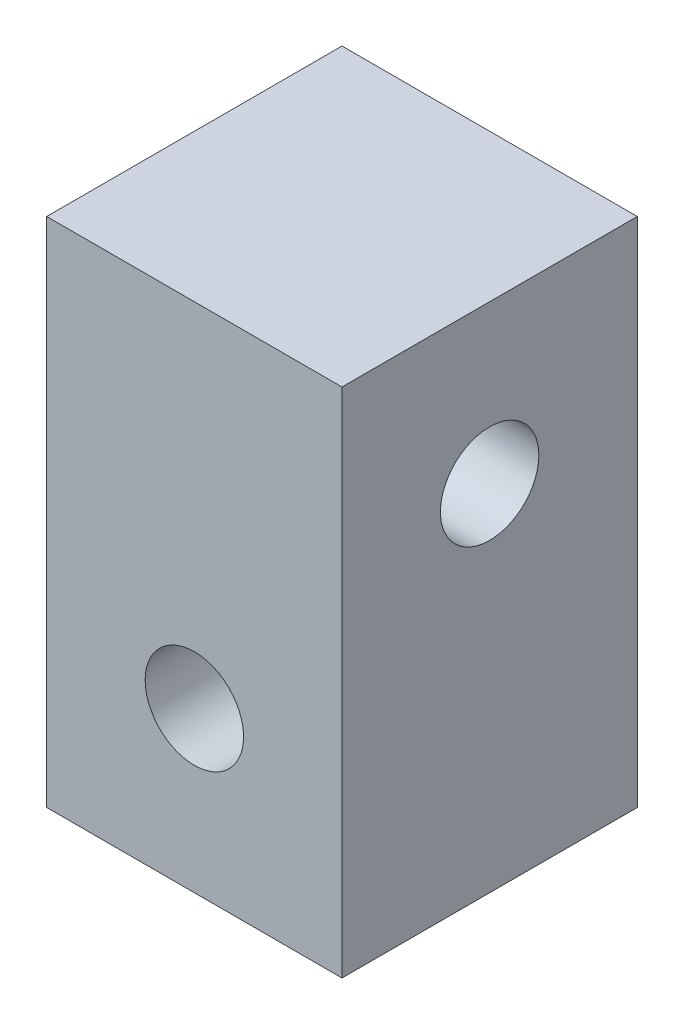
ISO-10303-21;
HEADER;
FILE_DESCRIPTION(('STEP AP214'),'2;1');
FILE_NAME('part.step','',(''),(''),'','','');
FILE_SCHEMA(('AUTOMOTIVE_DESIGN { 1 0 10303 214 1 1 1 1 }'));
ENDSEC;
DATA;
#1=APPLICATION_CONTEXT('core data for automotive mechanical design processes');
#2=APPLICATION_PROTOCOL_DEFINITION('international standard','automotive_design',2000,#1);
#3=PRODUCT_CONTEXT('',#1,'mechanical');
#4=PRODUCT('Part','Part','',(#3));
#5=PRODUCT_RELATED_PRODUCT_CATEGORY('part','',(#4));
#6=PRODUCT_DEFINITION_FORMATION('','',#4);
#7=PRODUCT_DEFINITION_CONTEXT('part definition',#1,'design');
#8=PRODUCT_DEFINITION('design','',#6,#7);
#9=PRODUCT_DEFINITION_SHAPE('','',#8);
#10=(LENGTH_UNIT() NAMED_UNIT(*) SI_UNIT(.MILLI.,.METRE.));
#11=(NAMED_UNIT(*) PLANE_ANGLE_UNIT() SI_UNIT($,.RADIAN.));
#12=(NAMED_UNIT(*) SI_UNIT($,.STERADIAN.) SOLID_ANGLE_UNIT());
#13=UNCERTAINTY_MEASURE_WITH_UNIT(LENGTH_MEASURE(1.E-05),#10,'distance_accuracy_value','');
#14=(GEOMETRIC_REPRESENTATION_CONTEXT(3) GLOBAL_UNCERTAINTY_ASSIGNED_CONTEXT((#13)) GLOBAL_UNIT_ASSIGNED_CONTEXT((#10,
#11,#12)) REPRESENTATION_CONTEXT('',''));
#15=CARTESIAN_POINT('',(0.,0.,0.));
#16=DIRECTION('',(0.,0.,1.));
#17=DIRECTION('',(1.,0.,0.));
#18=AXIS2_PLACEMENT_3D('',#15,#16,#17);
#19=CARTESIAN_POINT('',(3.75,13.,3.75));
#20=DIRECTION('',(-1.,0.,0.));
#21=DIRECTION('',(0.,0.,1.));
#22=AXIS2_PLACEMENT_3D('',#19,#20,#21);
#23=PLANE('',#22);
#24=CARTESIAN_POINT('',(3.75,9.,0.));
#25=DIRECTION('',(1.,0.,0.));
#26=DIRECTION('',(0.,0.,-1.));
#27=AXIS2_PLACEMENT_3D('',#24,#25,#26);
#28=CIRCLE('',#27,1.25);
#29=CARTESIAN_POINT('',(3.75,9.,-1.25));
#30=VERTEX_POINT('',#29);
#31=EDGE_CURVE('E142',#30,#30,#28,.T.);
#32=ORIENTED_EDGE('',*,*,#31,.F.);
#33=EDGE_LOOP('',(#32));
#34=FACE_BOUND('',#33,.T.);
#35=DIRECTION('',(0.,0.,-1.));
#36=VECTOR('',#35,1.);
#37=CARTESIAN_POINT('',(3.75,0.,3.75));
#38=LINE('',#37,#36);
#39=CARTESIAN_POINT('',(3.75,0.,3.75));
#40=VERTEX_POINT('',#39);
#41=CARTESIAN_POINT('',(3.75,0.,-3.75));
#42=VERTEX_POINT('',#41);
#43=EDGE_CURVE('E116',#40,#42,#38,.T.);
#44=ORIENTED_EDGE('',*,*,#43,.T.);
#45=DIRECTION('',(0.,-1.,0.));
#46=VECTOR('',#45,1.);
#47=CARTESIAN_POINT('',(3.75,13.,-3.75));
#48=LINE('',#47,#46);
#49=CARTESIAN_POINT('',(3.75,13.,-3.75));
#50=VERTEX_POINT('',#49);
#51=EDGE_CURVE('E11',#50,#42,#48,.T.);
#52=ORIENTED_EDGE('',*,*,#51,.F.);
#53=DIRECTION('',(0.,0.,-1.));
#54=VECTOR('',#53,1.);
#55=CARTESIAN_POINT('',(3.75,13.,3.75));
#56=LINE('',#55,#54);
#57=CARTESIAN_POINT('',(3.75,13.,3.75));
#58=VERTEX_POINT('',#57);
#59=EDGE_CURVE('E99',#58,#50,#56,.T.);
#60=ORIENTED_EDGE('',*,*,#59,.F.);
#61=DIRECTION('',(0.,-1.,0.));
#62=VECTOR('',#61,1.);
#63=CARTESIAN_POINT('',(3.75,13.,3.75));
#64=LINE('',#63,#62);
#65=EDGE_CURVE('E112',#58,#40,#64,.T.);
#66=ORIENTED_EDGE('',*,*,#65,.T.);
#67=EDGE_LOOP('',(#44,#52,#60,#66));
#68=FACE_BOUND('',#67,.T.);
#69=ADVANCED_FACE('F45',(#34,#68),#23,.F.);
#70=CARTESIAN_POINT('',(-3.75,13.,-3.75));
#71=DIRECTION('',(0.,0.,1.));
#72=DIRECTION('',(1.,0.,0.));
#73=AXIS2_PLACEMENT_3D('',#70,#71,#72);
#74=PLANE('',#73);
#75=CARTESIAN_POINT('',(0.,4.05305883438852,-3.75));
#76=DIRECTION('',(0.,0.,-1.));
#77=DIRECTION('',(-1.,0.,0.));
#78=AXIS2_PLACEMENT_3D('',#75,#76,#77);
#79=CIRCLE('',#78,1.25);
#80=CARTESIAN_POINT('',(-1.25,4.05305883438852,-3.75));
#81=VERTEX_POINT('',#80);
#82=EDGE_CURVE('E132',#81,#81,#79,.T.);
#83=ORIENTED_EDGE('',*,*,#82,.F.);
#84=EDGE_LOOP('',(#83));
#85=FACE_BOUND('',#84,.T.);
#86=DIRECTION('',(-1.,0.,0.));
#87=VECTOR('',#86,1.);
#88=CARTESIAN_POINT('',(-3.75,0.,-3.75));
#89=LINE('',#88,#87);
#90=CARTESIAN_POINT('',(-3.75,0.,-3.75));
#91=VERTEX_POINT('',#90);
#92=EDGE_CURVE('E104',#42,#91,#89,.T.);
#93=ORIENTED_EDGE('',*,*,#92,.T.);
#94=DIRECTION('',(0.,-1.,0.));
#95=VECTOR('',#94,1.);
#96=CARTESIAN_POINT('',(-3.75,13.,-3.75));
#97=LINE('',#96,#95);
#98=CARTESIAN_POINT('',(-3.75,13.,-3.75));
#99=VERTEX_POINT('',#98);
#100=EDGE_CURVE('E55',#99,#91,#97,.T.);
#101=ORIENTED_EDGE('',*,*,#100,.F.);
#102=DIRECTION('',(-1.,0.,0.));
#103=VECTOR('',#102,1.);
#104=CARTESIAN_POINT('',(-3.75,13.,-3.75));
#105=LINE('',#104,#103);
#106=EDGE_CURVE('E94',#50,#99,#105,.T.);
#107=ORIENTED_EDGE('',*,*,#106,.F.);
#108=ORIENTED_EDGE('',*,*,#51,.T.);
#109=EDGE_LOOP('',(#93,#101,#107,#108));
#110=FACE_BOUND('',#109,.T.);
#111=ADVANCED_FACE('F103',(#85,#110),#74,.F.);
#112=CARTESIAN_POINT('',(-3.75,13.,3.75));
#113=DIRECTION('',(1.,0.,0.));
#114=DIRECTION('',(0.,0.,-1.));
#115=AXIS2_PLACEMENT_3D('',#112,#113,#114);
#116=PLANE('',#115);
#117=CARTESIAN_POINT('',(-3.75,9.,0.));
#118=DIRECTION('',(1.,0.,0.));
#119=DIRECTION('',(0.,0.,-1.));
#120=AXIS2_PLACEMENT_3D('',#117,#118,#119);
#121=CIRCLE('',#120,1.25);
#122=CARTESIAN_POINT('',(-3.75,9.,-1.25));
#123=VERTEX_POINT('',#122);
#124=EDGE_CURVE('E48',#123,#123,#121,.T.);
#125=ORIENTED_EDGE('',*,*,#124,.T.);
#126=EDGE_LOOP('',(#125));
#127=FACE_BOUND('',#126,.T.);
#128=DIRECTION('',(0.,0.,1.));
#129=VECTOR('',#128,1.);
#130=CARTESIAN_POINT('',(-3.75,0.,3.75));
#131=LINE('',#130,#129);
#132=CARTESIAN_POINT('',(-3.75,0.,3.75));
#133=VERTEX_POINT('',#132);
#134=EDGE_CURVE('E81',#91,#133,#131,.T.);
#135=ORIENTED_EDGE('',*,*,#134,.T.);
#136=DIRECTION('',(0.,-1.,0.));
#137=VECTOR('',#136,1.);
#138=CARTESIAN_POINT('',(-3.75,13.,3.75));
#139=LINE('',#138,#137);
#140=CARTESIAN_POINT('',(-3.75,13.,3.75));
#141=VERTEX_POINT('',#140);
#142=EDGE_CURVE('E106',#141,#133,#139,.T.);
#143=ORIENTED_EDGE('',*,*,#142,.F.);
#144=DIRECTION('',(0.,0.,1.));
#145=VECTOR('',#144,1.);
#146=CARTESIAN_POINT('',(-3.75,13.,3.75));
#147=LINE('',#146,#145);
#148=EDGE_CURVE('E97',#99,#141,#147,.T.);
#149=ORIENTED_EDGE('',*,*,#148,.F.);
#150=ORIENTED_EDGE('',*,*,#100,.T.);
#151=EDGE_LOOP('',(#135,#143,#149,#150));
#152=FACE_BOUND('',#151,.T.);
#153=ADVANCED_FACE('F108',(#127,#152),#116,.F.);
#154=CARTESIAN_POINT('',(-3.75,13.,3.75));
#155=DIRECTION('',(0.,0.,-1.));
#156=DIRECTION('',(-1.,0.,0.));
#157=AXIS2_PLACEMENT_3D('',#154,#155,#156);
#158=PLANE('',#157);
#159=CARTESIAN_POINT('',(0.,4.05305883438852,3.75));
#160=DIRECTION('',(0.,0.,-1.));
#161=DIRECTION('',(-1.,0.,0.));
#162=AXIS2_PLACEMENT_3D('',#159,#160,#161);
#163=CIRCLE('',#162,1.25);
#164=CARTESIAN_POINT('',(-1.25,4.05305883438852,3.75));
#165=VERTEX_POINT('',#164);
#166=EDGE_CURVE('E120',#165,#165,#163,.T.);
#167=ORIENTED_EDGE('',*,*,#166,.T.);
#168=EDGE_LOOP('',(#167));
#169=FACE_BOUND('',#168,.T.);
#170=DIRECTION('',(1.,0.,0.));
#171=VECTOR('',#170,1.);
#172=CARTESIAN_POINT('',(-3.75,0.,3.75));
#173=LINE('',#172,#171);
#174=EDGE_CURVE('E87',#133,#40,#173,.T.);
#175=ORIENTED_EDGE('',*,*,#174,.T.);
#176=ORIENTED_EDGE('',*,*,#65,.F.);
#177=DIRECTION('',(1.,0.,0.));
#178=VECTOR('',#177,1.);
#179=CARTESIAN_POINT('',(-3.75,13.,3.75));
#180=LINE('',#179,#178);
#181=EDGE_CURVE('E64',#141,#58,#180,.T.);
#182=ORIENTED_EDGE('',*,*,#181,.F.);
#183=ORIENTED_EDGE('',*,*,#142,.T.);
#184=EDGE_LOOP('',(#175,#176,#182,#183));
#185=FACE_BOUND('',#184,.T.);
#186=ADVANCED_FACE('F166',(#169,#185),#158,.F.);
#187=CARTESIAN_POINT('',(0.,13.,0.));
#188=DIRECTION('',(0.,-1.,0.));
#189=DIRECTION('',(0.,0.,-1.));
#190=AXIS2_PLACEMENT_3D('',#187,#188,#189);
#191=PLANE('',#190);
#192=ORIENTED_EDGE('',*,*,#59,.T.);
#193=ORIENTED_EDGE('',*,*,#106,.T.);
#194=ORIENTED_EDGE('',*,*,#148,.T.);
#195=ORIENTED_EDGE('',*,*,#181,.T.);
#196=EDGE_LOOP('',(#192,#193,#194,#195));
#197=FACE_BOUND('',#196,.T.);
#198=ADVANCED_FACE('F95',(#197),#191,.F.);
#199=CARTESIAN_POINT('',(0.,0.,0.));
#200=DIRECTION('',(0.,-1.,0.));
#201=DIRECTION('',(0.,0.,-1.));
#202=AXIS2_PLACEMENT_3D('',#199,#200,#201);
#203=PLANE('',#202);
#204=ORIENTED_EDGE('',*,*,#43,.F.);
#205=ORIENTED_EDGE('',*,*,#174,.F.);
#206=ORIENTED_EDGE('',*,*,#134,.F.);
#207=ORIENTED_EDGE('',*,*,#92,.F.);
#208=EDGE_LOOP('',(#204,#205,#206,#207));
#209=FACE_BOUND('',#208,.T.);
#210=ADVANCED_FACE('F156',(#209),#203,.T.);
#211=CARTESIAN_POINT('',(0.,4.05305883438852,6.25));
#212=DIRECTION('',(0.,0.,-1.));
#213=DIRECTION('',(-1.,0.,0.));
#214=AXIS2_PLACEMENT_3D('',#211,#212,#213);
#215=CYLINDRICAL_SURFACE('',#214,1.25);
#216=ORIENTED_EDGE('',*,*,#82,.T.);
#217=EDGE_LOOP('',(#216));
#218=FACE_BOUND('',#217,.T.);
#219=ORIENTED_EDGE('',*,*,#166,.F.);
#220=EDGE_LOOP('',(#219));
#221=FACE_BOUND('',#220,.T.);
#222=ADVANCED_FACE('F158',(#218,#221),#215,.F.);
#223=CARTESIAN_POINT('',(-6.25,9.,0.));
#224=DIRECTION('',(1.,0.,0.));
#225=DIRECTION('',(0.,0.,-1.));
#226=AXIS2_PLACEMENT_3D('',#223,#224,#225);
#227=CYLINDRICAL_SURFACE('',#226,1.25);
#228=ORIENTED_EDGE('',*,*,#31,.T.);
#229=EDGE_LOOP('',(#228));
#230=FACE_BOUND('',#229,.T.);
#231=ORIENTED_EDGE('',*,*,#124,.F.);
#232=EDGE_LOOP('',(#231));
#233=FACE_BOUND('',#232,.T.);
#234=ADVANCED_FACE('F149',(#230,#233),#227,.F.);
#235=CLOSED_SHELL('',(#69,#111,#153,#186,#198,#210,#222,#234));
#236=MANIFOLD_SOLID_BREP('B2',#235);
#237=ADVANCED_BREP_SHAPE_REPRESENTATION('',(#18,#236),#14);
#238=SHAPE_DEFINITION_REPRESENTATION(#9,#237);
ENDSEC;
END-ISO-10303-21;
